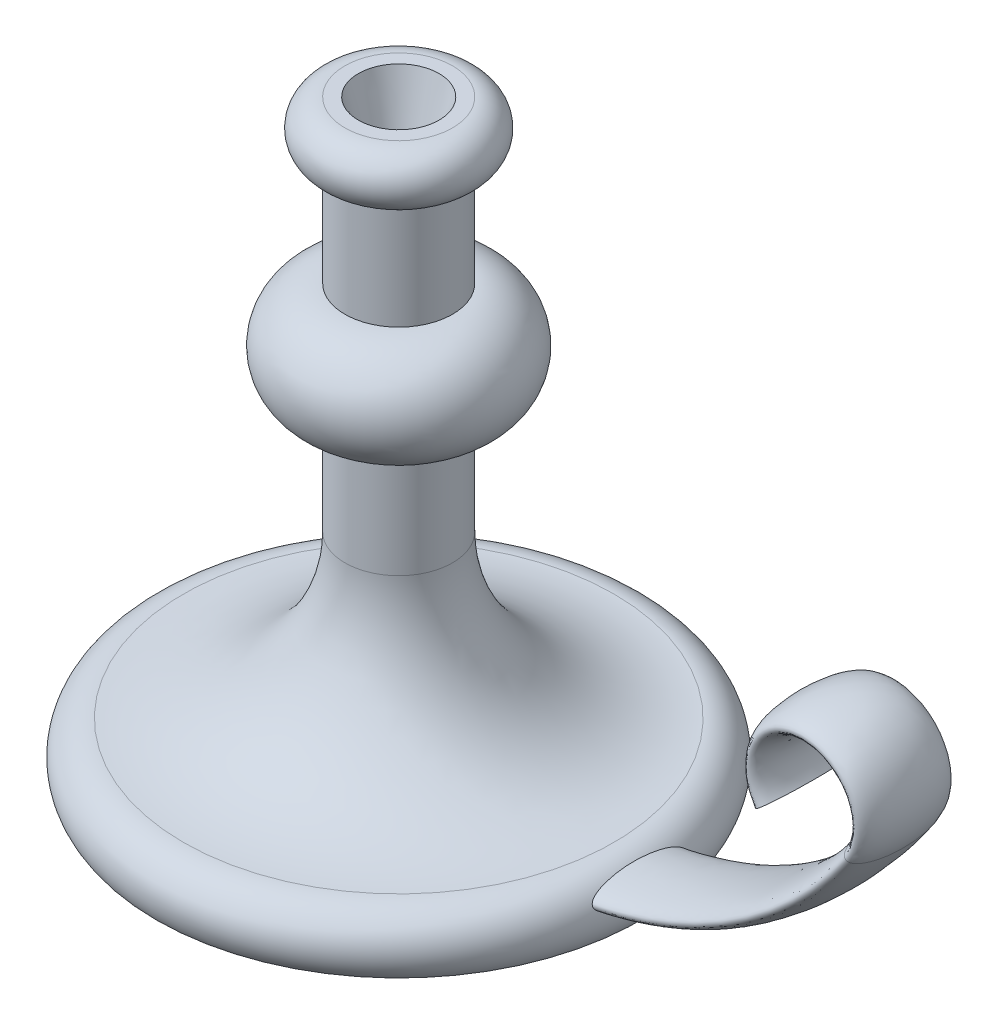
ISO-10303-21;
HEADER;
FILE_DESCRIPTION(('STEP AP214'),'2;1');
FILE_NAME('part.step','',(''),(''),'','','');
FILE_SCHEMA(('AUTOMOTIVE_DESIGN { 1 0 10303 214 1 1 1 1 }'));
ENDSEC;
DATA;
#1=APPLICATION_CONTEXT('core data for automotive mechanical design processes');
#2=APPLICATION_PROTOCOL_DEFINITION('international standard','automotive_design',2000,#1);
#3=PRODUCT_CONTEXT('',#1,'mechanical');
#4=PRODUCT('Part','Part','',(#3));
#5=PRODUCT_RELATED_PRODUCT_CATEGORY('part','',(#4));
#6=PRODUCT_DEFINITION_FORMATION('','',#4);
#7=PRODUCT_DEFINITION_CONTEXT('part definition',#1,'design');
#8=PRODUCT_DEFINITION('design','',#6,#7);
#9=PRODUCT_DEFINITION_SHAPE('','',#8);
#10=(LENGTH_UNIT() NAMED_UNIT(*) SI_UNIT(.MILLI.,.METRE.));
#11=(NAMED_UNIT(*) PLANE_ANGLE_UNIT() SI_UNIT($,.RADIAN.));
#12=(NAMED_UNIT(*) SI_UNIT($,.STERADIAN.) SOLID_ANGLE_UNIT());
#13=UNCERTAINTY_MEASURE_WITH_UNIT(LENGTH_MEASURE(1.E-05),#10,'distance_accuracy_value','');
#14=(GEOMETRIC_REPRESENTATION_CONTEXT(3) GLOBAL_UNCERTAINTY_ASSIGNED_CONTEXT((#13)) GLOBAL_UNIT_ASSIGNED_CONTEXT((#10,
#11,#12)) REPRESENTATION_CONTEXT('',''));
#15=CARTESIAN_POINT('',(0.,0.,0.));
#16=DIRECTION('',(0.,0.,1.));
#17=DIRECTION('',(1.,0.,0.));
#18=AXIS2_PLACEMENT_3D('',#15,#16,#17);
#19=CARTESIAN_POINT('',(0.,0.,0.));
#20=DIRECTION('',(0.,-1.,0.));
#21=DIRECTION('',(0.,0.,-1.));
#22=AXIS2_PLACEMENT_3D('',#19,#20,#21);
#23=PLANE('',#22);
#24=CARTESIAN_POINT('',(0.,0.,0.));
#25=DIRECTION('',(0.,-1.,0.));
#26=DIRECTION('',(0.,0.,-1.));
#27=AXIS2_PLACEMENT_3D('',#24,#25,#26);
#28=CIRCLE('',#27,90.);
#29=CARTESIAN_POINT('',(0.,0.,-90.));
#30=VERTEX_POINT('',#29);
#31=EDGE_CURVE('E76',#30,#30,#28,.T.);
#32=ORIENTED_EDGE('',*,*,#31,.T.);
#33=EDGE_LOOP('',(#32));
#34=FACE_BOUND('',#33,.T.);
#35=ADVANCED_FACE('F36',(#34),#23,.T.);
#36=CARTESIAN_POINT('',(20.,220.,0.));
#37=DIRECTION('',(0.,1.,0.));
#38=DIRECTION('',(0.,0.,1.));
#39=AXIS2_PLACEMENT_3D('',#36,#37,#38);
#40=PLANE('',#39);
#41=CARTESIAN_POINT('',(0.,220.,0.));
#42=DIRECTION('',(0.,1.,0.));
#43=DIRECTION('',(0.,0.,1.));
#44=AXIS2_PLACEMENT_3D('',#41,#42,#43);
#45=CIRCLE('',#44,15.);
#46=CARTESIAN_POINT('',(0.,220.,15.));
#47=VERTEX_POINT('',#46);
#48=EDGE_CURVE('E92',#47,#47,#45,.T.);
#49=ORIENTED_EDGE('',*,*,#48,.F.);
#50=EDGE_LOOP('',(#49));
#51=FACE_BOUND('',#50,.T.);
#52=CARTESIAN_POINT('',(0.,220.,0.));
#53=DIRECTION('',(0.,-1.,0.));
#54=DIRECTION('',(0.,0.,-1.));
#55=AXIS2_PLACEMENT_3D('',#52,#53,#54);
#56=CIRCLE('',#55,20.);
#57=CARTESIAN_POINT('',(0.,220.,-20.));
#58=VERTEX_POINT('',#57);
#59=EDGE_CURVE('E48',#58,#58,#56,.T.);
#60=ORIENTED_EDGE('',*,*,#59,.F.);
#61=EDGE_LOOP('',(#60));
#62=FACE_BOUND('',#61,.T.);
#63=ADVANCED_FACE('F99',(#51,#62),#40,.T.);
#64=CARTESIAN_POINT('',(0.,210.,0.));
#65=DIRECTION('',(0.,-1.,0.));
#66=DIRECTION('',(0.,0.,-1.));
#67=AXIS2_PLACEMENT_3D('',#64,#65,#66);
#68=TOROIDAL_SURFACE('',#67,20.,10.);
#69=ORIENTED_EDGE('',*,*,#59,.T.);
#70=EDGE_LOOP('',(#69));
#71=FACE_BOUND('',#70,.T.);
#72=CARTESIAN_POINT('',(0.,200.,0.));
#73=DIRECTION('',(0.,-1.,0.));
#74=DIRECTION('',(0.,0.,-1.));
#75=AXIS2_PLACEMENT_3D('',#72,#73,#74);
#76=CIRCLE('',#75,20.);
#77=CARTESIAN_POINT('',(0.,200.,-20.));
#78=VERTEX_POINT('',#77);
#79=EDGE_CURVE('E53',#78,#78,#76,.T.);
#80=ORIENTED_EDGE('',*,*,#79,.F.);
#81=EDGE_LOOP('',(#80));
#82=FACE_BOUND('',#81,.T.);
#83=ADVANCED_FACE('F102',(#71,#82),#68,.T.);
#84=CARTESIAN_POINT('',(0.,0.,0.));
#85=DIRECTION('',(0.,-1.,0.));
#86=DIRECTION('',(0.,0.,-1.));
#87=AXIS2_PLACEMENT_3D('',#84,#85,#86);
#88=CYLINDRICAL_SURFACE('',#87,20.);
#89=ORIENTED_EDGE('',*,*,#79,.T.);
#90=EDGE_LOOP('',(#89));
#91=FACE_BOUND('',#90,.T.);
#92=CARTESIAN_POINT('',(0.,160.,0.));
#93=DIRECTION('',(0.,-1.,0.));
#94=DIRECTION('',(0.,0.,-1.));
#95=AXIS2_PLACEMENT_3D('',#92,#93,#94);
#96=CIRCLE('',#95,20.);
#97=CARTESIAN_POINT('',(0.,160.,-20.));
#98=VERTEX_POINT('',#97);
#99=EDGE_CURVE('E58',#98,#98,#96,.T.);
#100=ORIENTED_EDGE('',*,*,#99,.F.);
#101=EDGE_LOOP('',(#100));
#102=FACE_BOUND('',#101,.T.);
#103=ADVANCED_FACE('F108',(#91,#102),#88,.T.);
#104=CARTESIAN_POINT('',(0.,140.,0.));
#105=DIRECTION('',(0.,-1.,0.));
#106=DIRECTION('',(0.,0.,-1.));
#107=AXIS2_PLACEMENT_3D('',#104,#105,#106);
#108=TOROIDAL_SURFACE('',#107,20.,20.);
#109=ORIENTED_EDGE('',*,*,#99,.T.);
#110=EDGE_LOOP('',(#109));
#111=FACE_BOUND('',#110,.T.);
#112=CARTESIAN_POINT('',(0.,120.,0.));
#113=DIRECTION('',(0.,-1.,0.));
#114=DIRECTION('',(0.,0.,-1.));
#115=AXIS2_PLACEMENT_3D('',#112,#113,#114);
#116=CIRCLE('',#115,20.);
#117=CARTESIAN_POINT('',(0.,120.,-20.));
#118=VERTEX_POINT('',#117);
#119=EDGE_CURVE('E64',#118,#118,#116,.T.);
#120=ORIENTED_EDGE('',*,*,#119,.F.);
#121=EDGE_LOOP('',(#120));
#122=FACE_BOUND('',#121,.T.);
#123=ADVANCED_FACE('F115',(#111,#122),#108,.T.);
#124=CARTESIAN_POINT('',(0.,0.,0.));
#125=DIRECTION('',(0.,-1.,0.));
#126=DIRECTION('',(0.,0.,-1.));
#127=AXIS2_PLACEMENT_3D('',#124,#125,#126);
#128=CYLINDRICAL_SURFACE('',#127,20.);
#129=ORIENTED_EDGE('',*,*,#119,.T.);
#130=EDGE_LOOP('',(#129));
#131=FACE_BOUND('',#130,.T.);
#132=CARTESIAN_POINT('',(0.,80.,0.));
#133=DIRECTION('',(0.,-1.,0.));
#134=DIRECTION('',(0.,0.,-1.));
#135=AXIS2_PLACEMENT_3D('',#132,#133,#134);
#136=CIRCLE('',#135,20.);
#137=CARTESIAN_POINT('',(0.,80.,-20.));
#138=VERTEX_POINT('',#137);
#139=EDGE_CURVE('E68',#138,#138,#136,.T.);
#140=ORIENTED_EDGE('',*,*,#139,.F.);
#141=EDGE_LOOP('',(#140));
#142=FACE_BOUND('',#141,.T.);
#143=ADVANCED_FACE('F119',(#131,#142),#128,.T.);
#144=CARTESIAN_POINT('',(0.,80.,0.));
#145=DIRECTION('',(0.,-1.,0.));
#146=DIRECTION('',(0.,0.,-1.));
#147=AXIS2_PLACEMENT_3D('',#144,#145,#146);
#148=TOROIDAL_SURFACE('',#147,80.,60.);
#149=ORIENTED_EDGE('',*,*,#139,.T.);
#150=EDGE_LOOP('',(#149));
#151=FACE_BOUND('',#150,.T.);
#152=CARTESIAN_POINT('',(0.,20.,0.));
#153=DIRECTION('',(0.,-1.,0.));
#154=DIRECTION('',(0.,0.,-1.));
#155=AXIS2_PLACEMENT_3D('',#152,#153,#154);
#156=CIRCLE('',#155,80.);
#157=CARTESIAN_POINT('',(0.,20.,-80.));
#158=VERTEX_POINT('',#157);
#159=EDGE_CURVE('E72',#158,#158,#156,.T.);
#160=ORIENTED_EDGE('',*,*,#159,.F.);
#161=EDGE_LOOP('',(#160));
#162=FACE_BOUND('',#161,.T.);
#163=ADVANCED_FACE('F123',(#151,#162),#148,.F.);
#164=CARTESIAN_POINT('',(0.,7.50000000000001,0.));
#165=DIRECTION('',(0.,-1.,0.));
#166=DIRECTION('',(0.,0.,-1.));
#167=AXIS2_PLACEMENT_3D('',#164,#165,#166);
#168=TOROIDAL_SURFACE('',#167,80.,12.5);
#169=CARTESIAN_POINT('',(89.5597422043342,12.9414346567555,17.5));
#170=CARTESIAN_POINT('',(89.5807278946485,12.8988393157081,17.5000019534777));
#171=CARTESIAN_POINT('',(89.6018125795404,12.8563039357769,17.4977816975197));
#172=CARTESIAN_POINT('',(89.6440155813562,12.7716938339371,17.489002543543));
#173=CARTESIAN_POINT('',(89.6651339056646,12.7296192360718,17.4824425050804));
#174=CARTESIAN_POINT('',(89.7283289297819,12.6045076597417,17.4565216692095));
#175=CARTESIAN_POINT('',(89.7702246464786,12.5226255894255,17.4309204730636));
#176=CARTESIAN_POINT('',(89.8644276523312,12.3407735771966,17.3563532007827));
#177=CARTESIAN_POINT('',(89.916211748319,12.242484901666,17.3027527423027));
#178=CARTESIAN_POINT('',(90.01638786814,12.0551458272008,17.1788263211439));
#179=CARTESIAN_POINT('',(90.0647710548456,11.966119226993,17.1084587296402));
#180=CARTESIAN_POINT('',(90.1524531790238,11.8069845229249,16.9652391551481));
#181=CARTESIAN_POINT('',(90.1921458014335,11.7358878994478,16.8936963434585));
#182=CARTESIAN_POINT('',(90.2690886261224,11.5996259068224,16.7438969488311));
#183=CARTESIAN_POINT('',(90.3063367280021,11.5344656201532,16.665634722265));
#184=CARTESIAN_POINT('',(90.3786756485819,11.4092540815105,16.5039763875564));
#185=CARTESIAN_POINT('',(90.4137624747614,11.349212210629,16.4205713158719));
#186=CARTESIAN_POINT('',(90.4819450166471,11.2336894025401,16.2499454917114));
#187=CARTESIAN_POINT('',(90.5150413047902,11.1782071523834,16.162725848809));
#188=CARTESIAN_POINT('',(90.5839705930101,11.0637251825689,15.9728919395736));
#189=CARTESIAN_POINT('',(90.6195406839563,11.0053156128849,15.8698282905888));
#190=CARTESIAN_POINT('',(90.6886668526269,10.8929143897208,15.6606649910658));
#191=CARTESIAN_POINT('',(90.7222226971282,10.8389232475745,15.5545649910506));
#192=CARTESIAN_POINT('',(90.787486486134,10.7348751403119,15.3401290691865));
#193=CARTESIAN_POINT('',(90.8191972688173,10.6848120890841,15.2317969483067));
#194=CARTESIAN_POINT('',(90.881005962979,10.5880683385414,15.0131968985225));
#195=CARTESIAN_POINT('',(90.9111039714557,10.5413874357516,14.9029290865686));
#196=CARTESIAN_POINT('',(90.979897363352,10.4355491517098,14.6427529331226));
#197=CARTESIAN_POINT('',(91.0180072010883,10.377593665576,14.492201207548));
#198=CARTESIAN_POINT('',(91.091887555317,10.2663462891691,14.1888070722871));
#199=CARTESIAN_POINT('',(91.1276577411367,10.2130550577559,14.0359643425397));
#200=CARTESIAN_POINT('',(91.1971197458645,10.1105127689612,13.7282685712581));
#201=CARTESIAN_POINT('',(91.2308091946811,10.0612662985098,13.573413471871));
#202=CARTESIAN_POINT('',(91.2962483962877,9.96642044574796,13.262180104172));
#203=CARTESIAN_POINT('',(91.3279980241889,9.9208212981999,13.1058017385396));
#204=CARTESIAN_POINT('',(91.4205951755327,9.78887458660795,12.6346162266684));
#205=CARTESIAN_POINT('',(91.4787589060981,9.70742476979592,12.3179025042442));
#206=CARTESIAN_POINT('',(91.5890957852254,9.5549382613015,11.6792188898601));
#207=CARTESIAN_POINT('',(91.641236506382,9.48395741425904,11.3572303186109));
#208=CARTESIAN_POINT('',(91.7397682682944,9.35136221163195,10.7107316640822));
#209=CARTESIAN_POINT('',(91.7861636672357,9.28974074823244,10.3862236929833));
#210=CARTESIAN_POINT('',(91.8736976604511,9.1746371831805,9.73512886653563));
#211=CARTESIAN_POINT('',(91.9148370779327,9.12115380666533,9.40854234516808));
#212=CARTESIAN_POINT('',(91.9930777751443,9.02031209920315,8.74630339912606));
#213=CARTESIAN_POINT('',(92.0300669877613,8.97311921137158,8.41061269264329));
#214=CARTESIAN_POINT('',(92.0991833927575,8.88559842477433,7.73783252743937));
#215=CARTESIAN_POINT('',(92.1313104056235,8.8452707794675,7.40074301754603));
#216=CARTESIAN_POINT('',(92.1909161961866,8.77092313439266,6.72537142355337));
#217=CARTESIAN_POINT('',(92.2183937480205,8.7369047978918,6.38708904887183));
#218=CARTESIAN_POINT('',(92.2688480816039,8.67476840304499,5.70964427774282));
#219=CARTESIAN_POINT('',(92.2918247141674,8.64665054027191,5.3704818525029));
#220=CARTESIAN_POINT('',(92.3540877228586,8.57076604630486,4.35367181244659));
#221=CARTESIAN_POINT('',(92.3868571977359,8.53128338370555,3.67498389641637));
#222=CARTESIAN_POINT('',(92.4356134743347,8.47274161832895,2.3161471150406));
#223=CARTESIAN_POINT('',(92.4515998737813,8.45368300509714,1.63599821506813));
#224=CARTESIAN_POINT('',(92.4661200478781,8.43637339284853,0.357955102331848));
#225=CARTESIAN_POINT('',(92.4665389208555,8.43587490179707,-0.23988885614374));
#226=CARTESIAN_POINT('',(92.4546362797528,8.45006241260829,-1.4353615385917));
#227=CARTESIAN_POINT('',(92.4423128974783,8.46475064105844,-2.03299021814846));
#228=CARTESIAN_POINT('',(92.4047541650815,8.50976680779928,-3.22745109478545));
#229=CARTESIAN_POINT('',(92.379514731688,8.54009969200437,-3.82428298010724));
#230=CARTESIAN_POINT('',(92.3157217367252,8.61743320229676,-5.01694606233257));
#231=CARTESIAN_POINT('',(92.2771508465328,8.66445552395919,-5.61277493756125));
#232=CARTESIAN_POINT('',(92.1861026743767,8.77678784246255,-6.80153886380932));
#233=CARTESIAN_POINT('',(92.1336290020919,8.84209309262499,-7.39447462535082));
#234=CARTESIAN_POINT('',(92.0437550848419,8.95574227206709,-8.28055229820502));
#235=CARTESIAN_POINT('',(92.0119455213755,8.99622894552011,-8.57528682166715));
#236=CARTESIAN_POINT('',(91.9444204496405,9.08291539794886,-9.16346094428871));
#237=CARTESIAN_POINT('',(91.9087051114865,9.12911492811456,-9.45690059926701));
#238=CARTESIAN_POINT('',(91.8331309715698,9.22782929334065,-10.0422906036682));
#239=CARTESIAN_POINT('',(91.7932707518514,9.28034629056379,-10.3342404073466));
#240=CARTESIAN_POINT('',(91.709117916737,9.39245062081625,-10.9161852811051));
#241=CARTESIAN_POINT('',(91.6648247441272,9.45203884286025,-11.206180100545));
#242=CARTESIAN_POINT('',(91.5713925727481,9.57931645333874,-11.7838191658166));
#243=CARTESIAN_POINT('',(91.5222504482682,9.6470110733692,-12.071461764307));
#244=CARTESIAN_POINT('',(91.4186796874406,9.791727300859,-12.6430805537629));
#245=CARTESIAN_POINT('',(91.3642572573635,9.86873798424088,-12.9270606150352));
#246=CARTESIAN_POINT('',(91.2493765391175,10.0339529747879,-13.4904217181463));
#247=CARTESIAN_POINT('',(91.1889212109097,10.1221517983453,-13.7698049377445));
#248=CARTESIAN_POINT('',(91.0929373870874,10.2648274882362,-14.1839125047644));
#249=CARTESIAN_POINT('',(91.0600757486262,10.3140904181848,-14.3210581267384));
#250=CARTESIAN_POINT('',(90.9923938569387,10.4165511027191,-14.5933763477647));
#251=CARTESIAN_POINT('',(90.9575737807137,10.4697485018483,-14.7285491237342));
#252=CARTESIAN_POINT('',(90.8810851838777,10.5878451344078,-15.0138774923675));
#253=CARTESIAN_POINT('',(90.8391147723957,10.6533666208411,-15.1636969104746));
#254=CARTESIAN_POINT('',(90.7519625692612,10.7912189771814,-15.4593295355899));
#255=CARTESIAN_POINT('',(90.7067794219569,10.8635527258307,-15.6051410149848));
#256=CARTESIAN_POINT('',(90.6128939496975,11.0160439629677,-15.8905749729623));
#257=CARTESIAN_POINT('',(90.5642084544311,11.0961646105685,-16.0302224467125));
#258=CARTESIAN_POINT('',(90.4624897667353,11.2662530107873,-16.3016394850687));
#259=CARTESIAN_POINT('',(90.4094613083908,11.3562100760682,-16.4334173639364));
#260=CARTESIAN_POINT('',(90.3114276481005,11.5255085385048,-16.655310813896));
#261=CARTESIAN_POINT('',(90.2675273757817,11.6022608890606,-16.747864447136));
#262=CARTESIAN_POINT('',(90.1761749534326,11.7643292238687,-16.9236630994732));
#263=CARTESIAN_POINT('',(90.1287172073378,11.849658775493,-17.0068929161981));
#264=CARTESIAN_POINT('',(90.0292807633426,12.0313291797368,-17.160728121925));
#265=CARTESIAN_POINT('',(89.9772518064337,12.1277974407354,-17.2311575389091));
#266=CARTESIAN_POINT('',(89.8965437818878,12.2800613987941,-17.3212876850735));
#267=CARTESIAN_POINT('',(89.8692277989253,12.3320164153136,-17.3487242132161));
#268=CARTESIAN_POINT('',(89.8138320311432,12.4382955168477,-17.3975211145679));
#269=CARTESIAN_POINT('',(89.7857527202502,12.4926181439797,-17.418885167671));
#270=CARTESIAN_POINT('',(89.7185869780336,12.6237048005598,-17.4611772226903));
#271=CARTESIAN_POINT('',(89.6792533408887,12.7013692224275,-17.4790502108363));
#272=CARTESIAN_POINT('',(89.6005512815564,12.8586256339484,-17.4997317533412));
#273=CARTESIAN_POINT('',(89.5611829132233,12.9382160139948,-17.5025524785485));
#274=CARTESIAN_POINT('',(89.4835317885697,13.0969633423243,-17.4927372657774));
#275=CARTESIAN_POINT('',(89.4452490812937,13.1761202708963,-17.4801006306501));
#276=CARTESIAN_POINT('',(89.3707047667355,13.3318071774562,-17.440649407729));
#277=CARTESIAN_POINT('',(89.3344452993772,13.408334342353,-17.413820111618));
#278=CARTESIAN_POINT('',(89.2510611220235,13.5858554385682,-17.3357126521073));
#279=CARTESIAN_POINT('',(89.2050998650832,13.6849823777219,-17.2790047620841));
#280=CARTESIAN_POINT('',(89.1180744174556,13.8744276311818,-17.1491670423827));
#281=CARTESIAN_POINT('',(89.0770301058259,13.9647099356685,-17.0759737821299));
#282=CARTESIAN_POINT('',(89.0037033744712,14.127143485757,-16.9270577307041));
#283=CARTESIAN_POINT('',(88.9709541551904,14.2001945680731,-16.8525208708987));
#284=CARTESIAN_POINT('',(88.9084968426191,14.3401811690448,-16.6970292692112));
#285=CARTESIAN_POINT('',(88.8787841266134,14.4071259665768,-16.6160846261895));
#286=CARTESIAN_POINT('',(88.821781438855,14.5359995630881,-16.449070962768));
#287=CARTESIAN_POINT('',(88.7944998605827,14.597910924241,-16.3629857823213));
#288=CARTESIAN_POINT('',(88.742066743737,14.7171734064658,-16.1870697873634));
#289=CARTESIAN_POINT('',(88.7169159331092,14.7745229686599,-16.0972377082953));
#290=CARTESIAN_POINT('',(88.6682699235337,14.885589909051,-15.9140699306466));
#291=CARTESIAN_POINT('',(88.6447869137157,14.9392804489424,-15.8207148279063));
#292=CARTESIAN_POINT('',(88.5993971939428,15.043100884388,-15.6316626961437));
#293=CARTESIAN_POINT('',(88.5774907604159,15.09323015551,-15.5359652603528));
#294=CARTESIAN_POINT('',(88.5137514786221,15.2390285874184,-15.2458062448792));
#295=CARTESIAN_POINT('',(88.4739596847914,15.3299685477357,-15.0485147207852));
#296=CARTESIAN_POINT('',(88.3985337506616,15.5017775203623,-14.6487152633394));
#297=CARTESIAN_POINT('',(88.362902963484,15.5826384140038,-14.446203281348));
#298=CARTESIAN_POINT('',(88.2948356711213,15.7363066128669,-14.0365764701697));
#299=CARTESIAN_POINT('',(88.262414229517,15.8090761199814,-13.8294450545357));
#300=CARTESIAN_POINT('',(88.2003835751383,15.9473648801954,-13.4126289871769));
#301=CARTESIAN_POINT('',(88.1707714189815,16.012891733822,-13.2029472733591));
#302=CARTESIAN_POINT('',(88.1139049361939,16.1377375745619,-12.781494994631));
#303=CARTESIAN_POINT('',(88.086650040851,16.1970580597502,-12.5697249473637));
#304=CARTESIAN_POINT('',(88.0276172572032,16.3244235662303,-12.0912931700788));
#305=CARTESIAN_POINT('',(87.9964138193046,16.3909381265492,-11.8241540502354));
#306=CARTESIAN_POINT('',(87.9367717636618,16.5165936764718,-11.2878278414659));
#307=CARTESIAN_POINT('',(87.9083334164422,16.5757339447658,-11.0186405549284));
#308=CARTESIAN_POINT('',(87.8539266282973,16.6875098948955,-10.4785408424893));
#309=CARTESIAN_POINT('',(87.8279593730488,16.7401424577993,-10.2076276543204));
#310=CARTESIAN_POINT('',(87.7783184309333,16.8395301522935,-9.66451167999945));
#311=CARTESIAN_POINT('',(87.7546448506397,16.8862850108116,-9.39230883454045));
#312=CARTESIAN_POINT('',(87.6869994555326,17.0182803050946,-8.57578965921921));
#313=CARTESIAN_POINT('',(87.6462388525847,17.0955854003685,-8.02991167225593));
#314=CARTESIAN_POINT('',(87.5728065515612,17.2320145687301,-6.93552385094154));
#315=CARTESIAN_POINT('',(87.5401330675683,17.2911426566326,-6.3870146249825));
#316=CARTESIAN_POINT('',(87.4828441952971,17.3930876120973,-5.28955884851079));
#317=CARTESIAN_POINT('',(87.4582074588682,17.4359477429321,-4.7406174041274));
#318=CARTESIAN_POINT('',(87.4169410999173,17.50688849347,-3.64146108218945));
#319=CARTESIAN_POINT('',(87.4003119088603,17.5349683167838,-3.09124613762045));
#320=CARTESIAN_POINT('',(87.375169948199,17.5771566462024,-1.98980868969492));
#321=CARTESIAN_POINT('',(87.3666614689744,17.5912577671531,-1.43858580772414));
#322=CARTESIAN_POINT('',(87.3578539704596,17.6058511840595,-0.335909067648647));
#323=CARTESIAN_POINT('',(87.3575547550007,17.6063438052041,0.215544784621891));
#324=CARTESIAN_POINT('',(87.3651677510508,17.5937352162514,1.3181582277588));
#325=CARTESIAN_POINT('',(87.3730787250643,17.5806360547997,1.86931785044721));
#326=CARTESIAN_POINT('',(87.3970372477742,17.5404868292748,2.97097544677332));
#327=CARTESIAN_POINT('',(87.4130850653537,17.5134363041762,3.52147339794337));
#328=CARTESIAN_POINT('',(87.453199681308,17.4446213827579,4.62112135666372));
#329=CARTESIAN_POINT('',(87.477264459379,17.4028606933023,5.17027166873715));
#330=CARTESIAN_POINT('',(87.5333316774058,17.3033707612736,6.26670053623086));
#331=CARTESIAN_POINT('',(87.5653334299479,17.2456429015521,6.81397924958928));
#332=CARTESIAN_POINT('',(87.6208220531228,17.142904950909,7.65503321383313));
#333=CARTESIAN_POINT('',(87.6414679669257,17.1042333246746,7.94978028808452));
#334=CARTESIAN_POINT('',(87.6851649593453,17.021225070156,8.53829462761815));
#335=CARTESIAN_POINT('',(87.7082159678748,16.9768886069433,8.83206192119503));
#336=CARTESIAN_POINT('',(87.7568106691334,16.8820510369685,9.4182719723652));
#337=CARTESIAN_POINT('',(87.7823533405998,16.8315524537751,9.71071522164481));
#338=CARTESIAN_POINT('',(87.8360989952262,16.7237193681056,10.2940938312718));
#339=CARTESIAN_POINT('',(87.8643018909554,16.6663850902747,10.5850292408445));
#340=CARTESIAN_POINT('',(87.9147712499545,16.5622842610511,11.0784529887195));
#341=CARTESIAN_POINT('',(87.9362980252951,16.5174691899796,11.2814293835307));
#342=CARTESIAN_POINT('',(87.9809118301301,16.4236835134758,11.6862455623049));
#343=CARTESIAN_POINT('',(88.003998812335,16.374713033981,11.8880853805166));
#344=CARTESIAN_POINT('',(88.051919824494,16.2721215384766,12.290562164882));
#345=CARTESIAN_POINT('',(88.0767553337321,16.2184965755436,12.491197952839));
#346=CARTESIAN_POINT('',(88.1283787004665,16.1060707847346,12.8907612736815));
#347=CARTESIAN_POINT('',(88.155166493302,16.047270128267,13.0896888628998));
#348=CARTESIAN_POINT('',(88.2109999780501,15.9237718205583,13.485420123139));
#349=CARTESIAN_POINT('',(88.2400459194856,15.8590735174972,13.682223556699));
#350=CARTESIAN_POINT('',(88.300802799943,15.7228691935859,14.0730419872877));
#351=CARTESIAN_POINT('',(88.3325134779581,15.6513638393851,14.2670572552382));
#352=CARTESIAN_POINT('',(88.3991424541957,15.5003948115866,14.651197359112));
#353=CARTESIAN_POINT('',(88.4340575115813,15.4209391715433,14.8413258930644));
#354=CARTESIAN_POINT('',(88.5079196083045,15.2523848762572,15.2164401400154));
#355=CARTESIAN_POINT('',(88.5468648114127,15.1632906117657,15.4014281468477));
#356=CARTESIAN_POINT('',(88.6092096238848,15.0206579718877,15.673311422963));
#357=CARTESIAN_POINT('',(88.6306485895099,14.9716086740032,15.7630166800359));
#358=CARTESIAN_POINT('',(88.675042275331,14.8701248615227,15.9401002079363));
#359=CARTESIAN_POINT('',(88.6979967332494,14.8176909327205,16.0274788777589));
#360=CARTESIAN_POINT('',(88.7456840101797,14.708947884428,16.1993887567125));
#361=CARTESIAN_POINT('',(88.7704179688268,14.6526362825897,16.2839180892536));
#362=CARTESIAN_POINT('',(88.8219484857477,14.5356422617909,16.4492391224748));
#363=CARTESIAN_POINT('',(88.8487445345046,14.4749609227748,16.5300317386025));
#364=CARTESIAN_POINT('',(88.8976102788185,14.3647434848953,16.6667168433046));
#365=CARTESIAN_POINT('',(88.9191374191608,14.3163230322084,16.7236955334941));
#366=CARTESIAN_POINT('',(88.9637080676467,14.2164452982162,16.8342912802669));
#367=CARTESIAN_POINT('',(88.9867519478512,14.1649872721067,16.8879075056813));
#368=CARTESIAN_POINT('',(89.0583610181499,14.0058008216801,17.0423310846551));
#369=CARTESIAN_POINT('',(89.1095289234103,13.8929758416961,17.1370796109721));
#370=CARTESIAN_POINT('',(89.1999001554573,13.6963386208979,17.2707956184662));
#371=CARTESIAN_POINT('',(89.236750516932,13.6167644879687,17.3175503480627));
#372=CARTESIAN_POINT('',(89.3136877653848,13.4522974166016,17.3968468737184));
#373=CARTESIAN_POINT('',(89.3537667767864,13.3674175273969,17.4294220837179));
#374=CARTESIAN_POINT('',(89.4217091217891,13.2251848973546,17.4685967336682));
#375=CARTESIAN_POINT('',(89.4488093840978,13.1688551716179,17.4803204652975));
#376=CARTESIAN_POINT('',(89.5037947740349,13.0554594934973,17.4960211898048));
#377=CARTESIAN_POINT('',(89.5316799818999,12.9983934661742,17.499997387795));
#378=CARTESIAN_POINT('',(89.5597422043342,12.9414346567555,17.5));
#379=B_SPLINE_CURVE_WITH_KNOTS('',3,(#169,#170,#171,#172,#173,#174,#175,#176,#177,#178,#179,
#180,#181,#182,#183,#184,#185,#186,#187,#188,#189,#190,#191,#192,#193,#194,#195,#196,#197,#198,
#199,#200,#201,#202,#203,#204,#205,#206,#207,#208,#209,#210,#211,#212,#213,#214,#215,#216,#217,
#218,#219,#220,#221,#222,#223,#224,#225,#226,#227,#228,#229,#230,#231,#232,#233,#234,#235,#236,
#237,#238,#239,#240,#241,#242,#243,#244,#245,#246,#247,#248,#249,#250,#251,#252,#253,#254,#255,
#256,#257,#258,#259,#260,#261,#262,#263,#264,#265,#266,#267,#268,#269,#270,#271,#272,#273,#274,
#275,#276,#277,#278,#279,#280,#281,#282,#283,#284,#285,#286,#287,#288,#289,#290,#291,#292,#293,
#294,#295,#296,#297,#298,#299,#300,#301,#302,#303,#304,#305,#306,#307,#308,#309,#310,#311,#312,
#313,#314,#315,#316,#317,#318,#319,#320,#321,#322,#323,#324,#325,#326,#327,#328,#329,#330,#331,
#332,#333,#334,#335,#336,#337,#338,#339,#340,#341,#342,#343,#344,#345,#346,#347,#348,#349,#350,
#351,#352,#353,#354,#355,#356,#357,#358,#359,#360,#361,#362,#363,#364,#365,#366,#367,#368,#369,
#370,#371,#372,#373,#374,#375,#376,#377,#378),.UNSPECIFIED.,.T.,.F.,(4,2,2,2,2,2,2,2,2,2,2,2,2,
2,2,2,2,2,2,2,2,2,2,2,2,2,2,2,2,2,2,2,2,2,2,2,2,2,2,2,2,2,2,2,2,2,2,2,2,2,2,2,2,2,2,2,2,2,2,2,2,
2,2,2,2,2,2,2,2,2,2,2,2,2,2,2,2,2,2,2,2,2,2,2,2,2,2,2,2,2,2,2,2,2,2,2,2,2,2,2,2,2,2,2,4),(0.,
0.142381357158823,0.284800145338818,0.569778369710417,0.937790990160535,1.30672699797603,
1.63143353328554,1.95641550824172,2.28198085179477,2.60745211744532,2.97835758825749,
3.34930592253145,3.71966767593578,4.09000712931068,4.58717127025781,5.08440552627608,
5.58219609730426,6.08001868322211,7.07612740491156,8.07737111401424,9.07785060328486,
10.078173201863,11.1010679437463,12.124000441837,13.1472022244408,14.1704379160044,
16.2117115539475,18.2530341182274,20.046245769242,21.8397203676841,23.6337623045227,
25.4301450150664,27.2260617741974,28.1235892294176,29.0210776087002,29.9188740333846,
30.816783451432,31.7152755049919,32.6127240115716,33.5097343419001,33.9578247270812,
34.4058746792326,34.9121604747936,35.4186611861168,35.9228725276492,36.4265413835619,
36.8100240505596,37.1941231504199,37.5831580539591,37.7772586450041,37.9712413599167,
38.2366258142316,38.5017956533799,38.7669774525069,39.0324346081147,39.3996555983547,
39.768314439312,40.0959866375238,40.4231523204126,40.751406998221,41.0797733710074,
41.4103344436376,41.7409533344649,42.4030339566265,43.0656444835726,43.7312306850944,
44.3961116446146,45.0608317450493,45.8918608553067,46.7229711882487,47.5544783139743,
48.3860240564135,50.0440426041158,51.7016946762991,53.3549069476162,55.0082082878425,
56.6623826267305,58.3165174374146,59.9704029618886,61.6243431428164,63.2778668395593,
64.9312473761624,65.8251617717366,66.7190501248656,67.6125736254178,68.5060677696807,
69.1329546330639,69.7598225042268,70.3872272415068,71.0146112082192,71.6420645989494,
72.269456603064,72.8962209263434,73.5227009279501,73.836017519838,74.1492800292288,
74.4627449766587,74.7761327179487,75.0094189443186,75.2427626113337,75.7080186392212,
76.0052441465107,76.3017654013236,76.4921392885516,76.6825327068869),.UNSPECIFIED.);
#380=CARTESIAN_POINT('',(89.5597422043342,12.9414346567555,17.5));
#381=VERTEX_POINT('',#380);
#382=EDGE_CURVE('E10',#381,#381,#379,.T.);
#383=ORIENTED_EDGE('',*,*,#382,.F.);
#384=EDGE_LOOP('',(#383));
#385=FACE_BOUND('',#384,.T.);
#386=ORIENTED_EDGE('',*,*,#159,.T.);
#387=EDGE_LOOP('',(#386));
#388=FACE_BOUND('',#387,.T.);
#389=ORIENTED_EDGE('',*,*,#31,.F.);
#390=EDGE_LOOP('',(#389));
#391=FACE_BOUND('',#390,.T.);
#392=ADVANCED_FACE('F126',(#385,#388,#391),#168,.T.);
#393=CARTESIAN_POINT('',(150.634185358261,75.,0.));
#394=DIRECTION('',(0.566666666666666,-0.823947139620552,0.));
#395=DIRECTION('',(0.,0.,-1.));
#396=AXIS2_PLACEMENT_3D('',#393,#394,#395);
#397=PLANE('',#396);
#398=CARTESIAN_POINT('',(150.634185358261,75.,0.));
#399=DIRECTION('',(0.566666666666666,-0.823947139620552,0.));
#400=DIRECTION('',(0.,0.,1.));
#401=AXIS2_PLACEMENT_3D('',#398,#399,#400);
#402=ELLIPSE('',#401,17.5,5.);
#403=CARTESIAN_POINT('',(150.634185358261,75.,17.5));
#404=VERTEX_POINT('',#403);
#405=EDGE_CURVE('E80',#404,#404,#402,.T.);
#406=ORIENTED_EDGE('',*,*,#405,.T.);
#407=EDGE_LOOP('',(#406));
#408=FACE_BOUND('',#407,.T.);
#409=ADVANCED_FACE('F131',(#408),#397,.T.);
#410=CARTESIAN_POINT('',(60.,10.,17.5));
#411=CARTESIAN_POINT('',(110.410191303973,10.,17.5));
#412=CARTESIAN_POINT('',(155.026295870831,33.4646670673665,17.5));
#413=CARTESIAN_POINT('',(183.592070943083,75.,17.5));
#414=CARTESIAN_POINT('',(60.,0.,17.5));
#415=CARTESIAN_POINT('',(113.770870724238,0.,17.5));
#416=CARTESIAN_POINT('',(161.36138226222,25.0289782051909,17.5));
#417=CARTESIAN_POINT('',(191.831542339288,69.3333333333333,17.5));
#418=CARTESIAN_POINT('',(60.,0.,-17.5));
#419=CARTESIAN_POINT('',(113.770870724238,0.,-17.5));
#420=CARTESIAN_POINT('',(161.36138226222,25.0289782051909,-17.5));
#421=CARTESIAN_POINT('',(191.831542339288,69.3333333333333,-17.5));
#422=CARTESIAN_POINT('',(60.,10.,-17.5));
#423=CARTESIAN_POINT('',(110.410191303973,10.,-17.5));
#424=CARTESIAN_POINT('',(155.026295870831,33.4646670673665,-17.5));
#425=CARTESIAN_POINT('',(183.592070943083,75.,-17.5));
#426=CARTESIAN_POINT('',(60.,20.,-17.5));
#427=CARTESIAN_POINT('',(107.049511883708,20.,-17.5));
#428=CARTESIAN_POINT('',(148.691209479443,41.9003559295421,-17.5));
#429=CARTESIAN_POINT('',(175.352599546877,80.6666666666666,-17.5));
#430=CARTESIAN_POINT('',(60.,20.,17.5));
#431=CARTESIAN_POINT('',(107.049511883708,20.,17.5));
#432=CARTESIAN_POINT('',(148.691209479443,41.9003559295421,17.5));
#433=CARTESIAN_POINT('',(175.352599546877,80.6666666666666,17.5));
#434=CARTESIAN_POINT('',(60.,10.,17.5));
#435=CARTESIAN_POINT('',(110.410191303973,10.,17.5));
#436=CARTESIAN_POINT('',(155.026295870831,33.4646670673665,17.5));
#437=CARTESIAN_POINT('',(183.592070943083,75.,17.5));
#438=(BOUNDED_SURFACE() B_SPLINE_SURFACE(3,3,((#410,#411,#412,#413),(#414,#415,#416,#417),(#418,
#419,#420,#421),(#422,#423,#424,#425),(#426,#427,#428,#429),(#430,#431,#432,#433),(#434,#435,
#436,#437)),.UNSPECIFIED.,.T.,.F.,.F.) B_SPLINE_SURFACE_WITH_KNOTS((4,3,4),(4,4),(0.,0.5,1.),
(0.,1.),.UNSPECIFIED.) GEOMETRIC_REPRESENTATION_ITEM() RATIONAL_B_SPLINE_SURFACE(((1.,
0.923374135437856,0.923374135437856,1.),(0.333333333333333,0.307791378479285,0.307791378479285,
0.333333333333333),(0.333333333333333,0.307791378479285,0.307791378479285,0.333333333333333),
(1.,0.923374135437856,0.923374135437856,1.),(0.333333333333333,0.307791378479285,
0.307791378479285,0.333333333333333),(0.333333333333333,0.307791378479285,0.307791378479285,
0.333333333333333),(1.,0.923374135437856,0.923374135437856,1.))) REPRESENTATION_ITEM('') SURFACE());
#439=CARTESIAN_POINT('',(183.592070943083,75.,0.));
#440=DIRECTION('',(0.566666666666667,0.823947139620552,0.));
#441=DIRECTION('',(0.,0.,1.));
#442=AXIS2_PLACEMENT_3D('',#439,#440,#441);
#443=ELLIPSE('',#442,17.5,5.);
#444=CARTESIAN_POINT('',(183.592070943083,75.,17.5));
#445=VERTEX_POINT('',#444);
#446=EDGE_CURVE('E84',#445,#445,#443,.T.);
#447=ORIENTED_EDGE('',*,*,#382,.T.);
#448=EDGE_LOOP('',(#447));
#449=FACE_BOUND('',#448,.T.);
#450=ORIENTED_EDGE('',*,*,#446,.F.);
#451=EDGE_LOOP('',(#450));
#452=FACE_BOUND('',#451,.T.);
#453=ADVANCED_FACE('F136',(#449,#452),#438,.T.);
#454=CARTESIAN_POINT('',(183.592070943083,75.,17.5));
#455=CARTESIAN_POINT('',(193.981461744242,90.1064273523801,17.5));
#456=CARTESIAN_POINT('',(185.447347211541,106.333333333333,17.5));
#457=CARTESIAN_POINT('',(167.113128150672,106.333333333333,17.5));
#458=CARTESIAN_POINT('',(148.778909089802,106.333333333333,17.5));
#459=CARTESIAN_POINT('',(140.244794557101,90.1064273523801,17.5));
#460=CARTESIAN_POINT('',(150.634185358261,75.,17.5));
#461=CARTESIAN_POINT('',(191.831542339288,69.3333333333333,17.5));
#462=CARTESIAN_POINT('',(207.415628541027,91.9929743619034,17.5));
#463=CARTESIAN_POINT('',(194.614456741976,116.333333333333,17.5));
#464=CARTESIAN_POINT('',(167.113128150672,116.333333333333,17.5));
#465=CARTESIAN_POINT('',(139.611799559367,116.333333333333,17.5));
#466=CARTESIAN_POINT('',(126.810627760316,91.9929743619035,17.5));
#467=CARTESIAN_POINT('',(142.394713962055,69.3333333333333,17.5));
#468=CARTESIAN_POINT('',(191.831542339288,69.3333333333333,-17.5));
#469=CARTESIAN_POINT('',(207.415628541027,91.9929743619034,-17.5));
#470=CARTESIAN_POINT('',(194.614456741976,116.333333333333,-17.5));
#471=CARTESIAN_POINT('',(167.113128150672,116.333333333333,-17.5));
#472=CARTESIAN_POINT('',(139.611799559367,116.333333333333,-17.5));
#473=CARTESIAN_POINT('',(126.810627760316,91.9929743619035,-17.5));
#474=CARTESIAN_POINT('',(142.394713962055,69.3333333333333,-17.5));
#475=CARTESIAN_POINT('',(183.592070943083,75.,-17.5));
#476=CARTESIAN_POINT('',(193.981461744242,90.1064273523801,-17.5));
#477=CARTESIAN_POINT('',(185.447347211541,106.333333333333,-17.5));
#478=CARTESIAN_POINT('',(167.113128150672,106.333333333333,-17.5));
#479=CARTESIAN_POINT('',(148.778909089802,106.333333333333,-17.5));
#480=CARTESIAN_POINT('',(140.244794557101,90.1064273523801,-17.5));
#481=CARTESIAN_POINT('',(150.634185358261,75.,-17.5));
#482=CARTESIAN_POINT('',(175.352599546877,80.6666666666667,-17.5));
#483=CARTESIAN_POINT('',(180.547294947457,88.2198803428567,-17.5));
#484=CARTESIAN_POINT('',(176.280237681106,96.3333333333333,-17.5));
#485=CARTESIAN_POINT('',(167.113128150672,96.3333333333333,-17.5));
#486=CARTESIAN_POINT('',(157.946018620237,96.3333333333333,-17.5));
#487=CARTESIAN_POINT('',(153.678961353886,88.2198803428567,-17.5));
#488=CARTESIAN_POINT('',(158.873656754466,80.6666666666667,-17.5));
#489=CARTESIAN_POINT('',(175.352599546877,80.6666666666667,17.5));
#490=CARTESIAN_POINT('',(180.547294947457,88.2198803428567,17.5));
#491=CARTESIAN_POINT('',(176.280237681106,96.3333333333333,17.5));
#492=CARTESIAN_POINT('',(167.113128150672,96.3333333333333,17.5));
#493=CARTESIAN_POINT('',(157.946018620237,96.3333333333333,17.5));
#494=CARTESIAN_POINT('',(153.678961353886,88.2198803428567,17.5));
#495=CARTESIAN_POINT('',(158.873656754466,80.6666666666667,17.5));
#496=CARTESIAN_POINT('',(183.592070943083,75.,17.5));
#497=CARTESIAN_POINT('',(193.981461744242,90.1064273523801,17.5));
#498=CARTESIAN_POINT('',(185.447347211541,106.333333333333,17.5));
#499=CARTESIAN_POINT('',(167.113128150672,106.333333333333,17.5));
#500=CARTESIAN_POINT('',(148.778909089802,106.333333333333,17.5));
#501=CARTESIAN_POINT('',(140.244794557101,90.1064273523801,17.5));
#502=CARTESIAN_POINT('',(150.634185358261,75.,17.5));
#503=(BOUNDED_SURFACE() B_SPLINE_SURFACE(3,3,((#454,#455,#456,#457,#458,#459,#460),(#461,#462,
#463,#464,#465,#466,#467),(#468,#469,#470,#471,#472,#473,#474),(#475,#476,#477,#478,#479,#480,
#481),(#482,#483,#484,#485,#486,#487,#488),(#489,#490,#491,#492,#493,#494,#495),(#496,#497,#498,
#499,#500,#501,#502)),.UNSPECIFIED.,.T.,.F.,.F.) B_SPLINE_SURFACE_WITH_KNOTS((4,3,4),(4,3,4),
(0.,0.5,1.),(0.,0.5,1.),
.UNSPECIFIED.) GEOMETRIC_REPRESENTATION_ITEM() RATIONAL_B_SPLINE_SURFACE(((1.,0.643649778750421,
0.643649778750421,1.,0.643649778750421,0.643649778750421,1.),(0.333333333333333,
0.21454992625014,0.21454992625014,0.333333333333333,0.21454992625014,0.21454992625014,
0.333333333333333),(0.333333333333333,0.21454992625014,0.21454992625014,0.333333333333333,
0.21454992625014,0.21454992625014,0.333333333333333),(1.,0.643649778750421,0.643649778750421,1.,
0.643649778750421,0.643649778750421,1.),(0.333333333333333,0.21454992625014,0.21454992625014,
0.333333333333333,0.21454992625014,0.21454992625014,0.333333333333333),(0.333333333333333,
0.21454992625014,0.21454992625014,0.333333333333333,0.21454992625014,0.21454992625014,
0.333333333333333),(1.,0.643649778750421,0.643649778750421,1.,0.643649778750421,
0.643649778750421,1.))) REPRESENTATION_ITEM('') SURFACE());
#504=ORIENTED_EDGE('',*,*,#405,.F.);
#505=EDGE_LOOP('',(#504));
#506=FACE_BOUND('',#505,.T.);
#507=ORIENTED_EDGE('',*,*,#446,.T.);
#508=EDGE_LOOP('',(#507));
#509=FACE_BOUND('',#508,.T.);
#510=ADVANCED_FACE('F133',(#506,#509),#503,.T.);
#511=CARTESIAN_POINT('',(0.,220.,0.));
#512=DIRECTION('',(0.,1.,0.));
#513=DIRECTION('',(0.,0.,1.));
#514=AXIS2_PLACEMENT_3D('',#511,#512,#513);
#515=CONICAL_SURFACE('',#514,15.,0.26179938779915);
#516=CARTESIAN_POINT('',(0.,195.,0.));
#517=DIRECTION('',(0.,1.,0.));
#518=DIRECTION('',(0.,0.,1.));
#519=AXIS2_PLACEMENT_3D('',#516,#517,#518);
#520=CIRCLE('',#519,8.30127018922192);
#521=CARTESIAN_POINT('',(0.,195.,8.30127018922192));
#522=VERTEX_POINT('',#521);
#523=EDGE_CURVE('E88',#522,#522,#520,.T.);
#524=ORIENTED_EDGE('',*,*,#523,.F.);
#525=EDGE_LOOP('',(#524));
#526=FACE_BOUND('',#525,.T.);
#527=ORIENTED_EDGE('',*,*,#48,.T.);
#528=EDGE_LOOP('',(#527));
#529=FACE_BOUND('',#528,.T.);
#530=ADVANCED_FACE('F97',(#526,#529),#515,.F.);
#531=CARTESIAN_POINT('',(0.,195.,0.));
#532=DIRECTION('',(0.,1.,0.));
#533=DIRECTION('',(0.,0.,1.));
#534=AXIS2_PLACEMENT_3D('',#531,#532,#533);
#535=PLANE('',#534);
#536=ORIENTED_EDGE('',*,*,#523,.T.);
#537=EDGE_LOOP('',(#536));
#538=FACE_BOUND('',#537,.T.);
#539=ADVANCED_FACE('F159',(#538),#535,.T.);
#540=CLOSED_SHELL('',(#35,#63,#83,#103,#123,#143,#163,#392,#409,#453,#510,#530,#539));
#541=MANIFOLD_SOLID_BREP('B2',#540);
#542=ADVANCED_BREP_SHAPE_REPRESENTATION('',(#18,#541),#14);
#543=SHAPE_DEFINITION_REPRESENTATION(#9,#542);
ENDSEC;
END-ISO-10303-21;
